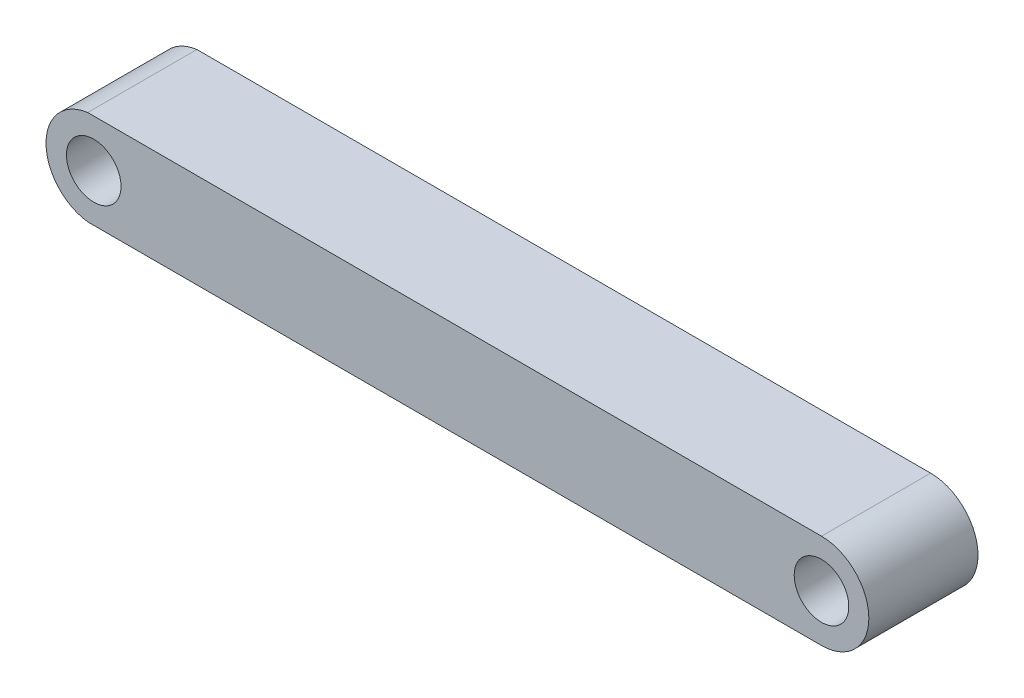
ISO-10303-21;
HEADER;
FILE_DESCRIPTION(('STEP AP214'),'2;1');
FILE_NAME('part.step','',(''),(''),'','','');
FILE_SCHEMA(('AUTOMOTIVE_DESIGN { 1 0 10303 214 1 1 1 1 }'));
ENDSEC;
DATA;
#1=APPLICATION_CONTEXT('core data for automotive mechanical design processes');
#2=APPLICATION_PROTOCOL_DEFINITION('international standard','automotive_design',2000,#1);
#3=PRODUCT_CONTEXT('',#1,'mechanical');
#4=PRODUCT('Part','Part','',(#3));
#5=PRODUCT_RELATED_PRODUCT_CATEGORY('part','',(#4));
#6=PRODUCT_DEFINITION_FORMATION('','',#4);
#7=PRODUCT_DEFINITION_CONTEXT('part definition',#1,'design');
#8=PRODUCT_DEFINITION('design','',#6,#7);
#9=PRODUCT_DEFINITION_SHAPE('','',#8);
#10=(LENGTH_UNIT() NAMED_UNIT(*) SI_UNIT(.MILLI.,.METRE.));
#11=(NAMED_UNIT(*) PLANE_ANGLE_UNIT() SI_UNIT($,.RADIAN.));
#12=(NAMED_UNIT(*) SI_UNIT($,.STERADIAN.) SOLID_ANGLE_UNIT());
#13=UNCERTAINTY_MEASURE_WITH_UNIT(LENGTH_MEASURE(1.E-05),#10,'distance_accuracy_value','');
#14=(GEOMETRIC_REPRESENTATION_CONTEXT(3) GLOBAL_UNCERTAINTY_ASSIGNED_CONTEXT((#13)) GLOBAL_UNIT_ASSIGNED_CONTEXT((#10,
#11,#12)) REPRESENTATION_CONTEXT('',''));
#15=CARTESIAN_POINT('',(0.,0.,0.));
#16=DIRECTION('',(0.,0.,1.));
#17=DIRECTION('',(1.,0.,0.));
#18=AXIS2_PLACEMENT_3D('',#15,#16,#17);
#19=CARTESIAN_POINT('',(-20.2509322553461,0.319741940629474,19.05));
#20=DIRECTION('',(0.,0.,1.));
#21=DIRECTION('',(1.,0.,0.));
#22=AXIS2_PLACEMENT_3D('',#19,#20,#21);
#23=PLANE('',#22);
#24=CARTESIAN_POINT('',(-20.2509322553461,0.319741940629474,19.05));
#25=DIRECTION('',(0.,0.,1.));
#26=DIRECTION('',(1.,0.,0.));
#27=AXIS2_PLACEMENT_3D('',#24,#25,#26);
#28=CIRCLE('',#27,4.7625);
#29=CARTESIAN_POINT('',(-25.0134322553461,0.319741940629474,19.05));
#30=VERTEX_POINT('',#29);
#31=EDGE_CURVE('E119',#30,#30,#28,.T.);
#32=ORIENTED_EDGE('',*,*,#31,.F.);
#33=EDGE_LOOP('',(#32));
#34=FACE_BOUND('',#33,.T.);
#35=CARTESIAN_POINT('',(-20.2509322553461,0.319741940629474,19.05));
#36=DIRECTION('',(0.,0.,1.));
#37=DIRECTION('',(1.,0.,0.));
#38=AXIS2_PLACEMENT_3D('',#35,#36,#37);
#39=CIRCLE('',#38,8.33038536614576);
#40=CARTESIAN_POINT('',(-21.2997323527019,8.58384132920666,19.05));
#41=VERTEX_POINT('',#40);
#42=CARTESIAN_POINT('',(-21.2997323527019,-7.94435744794771,19.05));
#43=VERTEX_POINT('',#42);
#44=EDGE_CURVE('E97',#41,#43,#39,.T.);
#45=ORIENTED_EDGE('',*,*,#44,.T.);
#46=DIRECTION('',(1.,0.,0.));
#47=VECTOR('',#46,1.);
#48=CARTESIAN_POINT('',(-21.2997323527019,-7.94435744794771,19.05));
#49=LINE('',#48,#47);
#50=CARTESIAN_POINT('',(106.749067744654,-7.94435744794771,19.05));
#51=VERTEX_POINT('',#50);
#52=EDGE_CURVE('E93',#43,#51,#49,.T.);
#53=ORIENTED_EDGE('',*,*,#52,.T.);
#54=CARTESIAN_POINT('',(106.749067744654,0.319741940629474,19.05));
#55=DIRECTION('',(0.,0.,1.));
#56=DIRECTION('',(-1.,0.,0.));
#57=AXIS2_PLACEMENT_3D('',#54,#55,#56);
#58=CIRCLE('',#57,8.26409938857719);
#59=CARTESIAN_POINT('',(106.749067744654,8.58384132920666,19.05));
#60=VERTEX_POINT('',#59);
#61=EDGE_CURVE('E96',#51,#60,#58,.T.);
#62=ORIENTED_EDGE('',*,*,#61,.T.);
#63=DIRECTION('',(-1.,0.,0.));
#64=VECTOR('',#63,1.);
#65=CARTESIAN_POINT('',(-21.2997323527019,8.58384132920666,19.05));
#66=LINE('',#65,#64);
#67=EDGE_CURVE('E64',#60,#41,#66,.T.);
#68=ORIENTED_EDGE('',*,*,#67,.T.);
#69=EDGE_LOOP('',(#45,#53,#62,#68));
#70=FACE_BOUND('',#69,.T.);
#71=CARTESIAN_POINT('',(106.749067744654,0.319741940629474,19.05));
#72=DIRECTION('',(0.,0.,1.));
#73=DIRECTION('',(1.,0.,0.));
#74=AXIS2_PLACEMENT_3D('',#71,#72,#73);
#75=CIRCLE('',#74,4.7625);
#76=CARTESIAN_POINT('',(101.986567744654,0.319741940629474,19.05));
#77=VERTEX_POINT('',#76);
#78=EDGE_CURVE('E139',#77,#77,#75,.T.);
#79=ORIENTED_EDGE('',*,*,#78,.F.);
#80=EDGE_LOOP('',(#79));
#81=FACE_BOUND('',#80,.T.);
#82=ADVANCED_FACE('F44',(#34,#70,#81),#23,.T.);
#83=CARTESIAN_POINT('',(-20.2509322553461,0.319741940629474,0.));
#84=DIRECTION('',(0.,0.,1.));
#85=DIRECTION('',(1.,0.,0.));
#86=AXIS2_PLACEMENT_3D('',#83,#84,#85);
#87=PLANE('',#86);
#88=CARTESIAN_POINT('',(-20.2509322553461,0.319741940629474,0.));
#89=DIRECTION('',(0.,0.,1.));
#90=DIRECTION('',(1.,0.,0.));
#91=AXIS2_PLACEMENT_3D('',#88,#89,#90);
#92=CIRCLE('',#91,8.33038536614576);
#93=CARTESIAN_POINT('',(-21.2997323527019,8.58384132920666,0.));
#94=VERTEX_POINT('',#93);
#95=CARTESIAN_POINT('',(-21.2997323527019,-7.94435744794771,0.));
#96=VERTEX_POINT('',#95);
#97=EDGE_CURVE('E114',#94,#96,#92,.T.);
#98=ORIENTED_EDGE('',*,*,#97,.F.);
#99=DIRECTION('',(-1.,0.,0.));
#100=VECTOR('',#99,1.);
#101=CARTESIAN_POINT('',(-21.2997323527019,8.58384132920666,0.));
#102=LINE('',#101,#100);
#103=CARTESIAN_POINT('',(106.749067744654,8.58384132920666,0.));
#104=VERTEX_POINT('',#103);
#105=EDGE_CURVE('E86',#104,#94,#102,.T.);
#106=ORIENTED_EDGE('',*,*,#105,.F.);
#107=CARTESIAN_POINT('',(106.749067744654,0.319741940629474,0.));
#108=DIRECTION('',(0.,0.,1.));
#109=DIRECTION('',(-1.,0.,0.));
#110=AXIS2_PLACEMENT_3D('',#107,#108,#109);
#111=CIRCLE('',#110,8.26409938857719);
#112=CARTESIAN_POINT('',(106.749067744654,-7.94435744794771,0.));
#113=VERTEX_POINT('',#112);
#114=EDGE_CURVE('E79',#113,#104,#111,.T.);
#115=ORIENTED_EDGE('',*,*,#114,.F.);
#116=DIRECTION('',(1.,0.,0.));
#117=VECTOR('',#116,1.);
#118=CARTESIAN_POINT('',(-21.2997323527019,-7.94435744794771,0.));
#119=LINE('',#118,#117);
#120=EDGE_CURVE('E104',#96,#113,#119,.T.);
#121=ORIENTED_EDGE('',*,*,#120,.F.);
#122=EDGE_LOOP('',(#98,#106,#115,#121));
#123=FACE_BOUND('',#122,.T.);
#124=CARTESIAN_POINT('',(-20.2509322553461,0.319741940629474,0.));
#125=DIRECTION('',(0.,0.,1.));
#126=DIRECTION('',(1.,0.,0.));
#127=AXIS2_PLACEMENT_3D('',#124,#125,#126);
#128=CIRCLE('',#127,4.7625);
#129=CARTESIAN_POINT('',(-25.0134322553461,0.319741940629474,0.));
#130=VERTEX_POINT('',#129);
#131=EDGE_CURVE('E136',#130,#130,#128,.T.);
#132=ORIENTED_EDGE('',*,*,#131,.T.);
#133=EDGE_LOOP('',(#132));
#134=FACE_BOUND('',#133,.T.);
#135=CARTESIAN_POINT('',(106.749067744654,0.319741940629474,0.));
#136=DIRECTION('',(0.,0.,1.));
#137=DIRECTION('',(1.,0.,0.));
#138=AXIS2_PLACEMENT_3D('',#135,#136,#137);
#139=CIRCLE('',#138,4.7625);
#140=CARTESIAN_POINT('',(101.986567744654,0.319741940629474,0.));
#141=VERTEX_POINT('',#140);
#142=EDGE_CURVE('E143',#141,#141,#139,.T.);
#143=ORIENTED_EDGE('',*,*,#142,.T.);
#144=EDGE_LOOP('',(#143));
#145=FACE_BOUND('',#144,.T.);
#146=ADVANCED_FACE('F131',(#123,#134,#145),#87,.F.);
#147=CARTESIAN_POINT('',(-20.2509322553461,0.319741940629474,19.05));
#148=DIRECTION('',(0.,0.,-1.));
#149=DIRECTION('',(-1.,0.,0.));
#150=AXIS2_PLACEMENT_3D('',#147,#148,#149);
#151=CYLINDRICAL_SURFACE('',#150,8.33038536614576);
#152=ORIENTED_EDGE('',*,*,#97,.T.);
#153=DIRECTION('',(0.,0.,-1.));
#154=VECTOR('',#153,1.);
#155=CARTESIAN_POINT('',(-21.2997323527019,-7.94435744794771,19.05));
#156=LINE('',#155,#154);
#157=EDGE_CURVE('E11',#43,#96,#156,.T.);
#158=ORIENTED_EDGE('',*,*,#157,.F.);
#159=ORIENTED_EDGE('',*,*,#44,.F.);
#160=DIRECTION('',(0.,0.,-1.));
#161=VECTOR('',#160,1.);
#162=CARTESIAN_POINT('',(-21.2997323527019,8.58384132920666,19.05));
#163=LINE('',#162,#161);
#164=EDGE_CURVE('E110',#41,#94,#163,.T.);
#165=ORIENTED_EDGE('',*,*,#164,.T.);
#166=EDGE_LOOP('',(#152,#158,#159,#165));
#167=FACE_BOUND('',#166,.T.);
#168=ADVANCED_FACE('F50',(#167),#151,.T.);
#169=CARTESIAN_POINT('',(-21.2997323527019,-7.94435744794771,19.05));
#170=DIRECTION('',(0.,1.,0.));
#171=DIRECTION('',(0.,0.,1.));
#172=AXIS2_PLACEMENT_3D('',#169,#170,#171);
#173=PLANE('',#172);
#174=ORIENTED_EDGE('',*,*,#120,.T.);
#175=DIRECTION('',(0.,0.,-1.));
#176=VECTOR('',#175,1.);
#177=CARTESIAN_POINT('',(106.749067744654,-7.94435744794771,19.05));
#178=LINE('',#177,#176);
#179=EDGE_CURVE('E54',#51,#113,#178,.T.);
#180=ORIENTED_EDGE('',*,*,#179,.F.);
#181=ORIENTED_EDGE('',*,*,#52,.F.);
#182=ORIENTED_EDGE('',*,*,#157,.T.);
#183=EDGE_LOOP('',(#174,#180,#181,#182));
#184=FACE_BOUND('',#183,.T.);
#185=ADVANCED_FACE('F105',(#184),#173,.F.);
#186=CARTESIAN_POINT('',(106.749067744654,0.319741940629474,19.05));
#187=DIRECTION('',(0.,0.,-1.));
#188=DIRECTION('',(-1.,0.,0.));
#189=AXIS2_PLACEMENT_3D('',#186,#187,#188);
#190=CYLINDRICAL_SURFACE('',#189,8.26409938857719);
#191=ORIENTED_EDGE('',*,*,#114,.T.);
#192=DIRECTION('',(0.,0.,-1.));
#193=VECTOR('',#192,1.);
#194=CARTESIAN_POINT('',(106.749067744654,8.58384132920666,19.05));
#195=LINE('',#194,#193);
#196=EDGE_CURVE('E103',#60,#104,#195,.T.);
#197=ORIENTED_EDGE('',*,*,#196,.F.);
#198=ORIENTED_EDGE('',*,*,#61,.F.);
#199=ORIENTED_EDGE('',*,*,#179,.T.);
#200=EDGE_LOOP('',(#191,#197,#198,#199));
#201=FACE_BOUND('',#200,.T.);
#202=ADVANCED_FACE('F106',(#201),#190,.T.);
#203=CARTESIAN_POINT('',(-21.2997323527019,8.58384132920666,19.05));
#204=DIRECTION('',(0.,-1.,0.));
#205=DIRECTION('',(0.,0.,-1.));
#206=AXIS2_PLACEMENT_3D('',#203,#204,#205);
#207=PLANE('',#206);
#208=ORIENTED_EDGE('',*,*,#105,.T.);
#209=ORIENTED_EDGE('',*,*,#164,.F.);
#210=ORIENTED_EDGE('',*,*,#67,.F.);
#211=ORIENTED_EDGE('',*,*,#196,.T.);
#212=EDGE_LOOP('',(#208,#209,#210,#211));
#213=FACE_BOUND('',#212,.T.);
#214=ADVANCED_FACE('F126',(#213),#207,.F.);
#215=CARTESIAN_POINT('',(-20.2509322553461,0.319741940629474,19.05));
#216=DIRECTION('',(0.,0.,-1.));
#217=DIRECTION('',(-1.,0.,0.));
#218=AXIS2_PLACEMENT_3D('',#215,#216,#217);
#219=CYLINDRICAL_SURFACE('',#218,4.7625);
#220=CARTESIAN_POINT('',(-25.0134322553461,0.319741940629474,19.05));
#221=CARTESIAN_POINT('',(-25.0134322553461,0.319741940629474,18.8515625));
#222=CARTESIAN_POINT('',(-25.0134322553461,0.319741940629474,18.653125));
#223=CARTESIAN_POINT('',(-25.0134322553461,0.319741940629474,18.25625));
#224=CARTESIAN_POINT('',(-25.0134322553461,0.319741940629474,18.0578125));
#225=CARTESIAN_POINT('',(-25.0134322553461,0.319741940629474,17.6609375));
#226=CARTESIAN_POINT('',(-25.0134322553461,0.319741940629474,17.4625));
#227=CARTESIAN_POINT('',(-25.0134322553461,0.319741940629474,17.065625));
#228=CARTESIAN_POINT('',(-25.0134322553461,0.319741940629474,16.8671875));
#229=CARTESIAN_POINT('',(-25.0134322553461,0.319741940629474,16.4703125));
#230=CARTESIAN_POINT('',(-25.0134322553461,0.319741940629474,16.271875));
#231=CARTESIAN_POINT('',(-25.0134322553461,0.319741940629474,15.875));
#232=CARTESIAN_POINT('',(-25.0134322553461,0.319741940629474,15.6765625));
#233=CARTESIAN_POINT('',(-25.0134322553461,0.319741940629474,15.2796875));
#234=CARTESIAN_POINT('',(-25.0134322553461,0.319741940629474,15.08125));
#235=CARTESIAN_POINT('',(-25.0134322553461,0.319741940629474,14.684375));
#236=CARTESIAN_POINT('',(-25.0134322553461,0.319741940629474,14.4859375));
#237=CARTESIAN_POINT('',(-25.0134322553461,0.319741940629474,14.0890625));
#238=CARTESIAN_POINT('',(-25.0134322553461,0.319741940629474,13.890625));
#239=CARTESIAN_POINT('',(-25.0134322553461,0.319741940629474,13.49375));
#240=CARTESIAN_POINT('',(-25.0134322553461,0.319741940629474,13.2953125));
#241=CARTESIAN_POINT('',(-25.0134322553461,0.319741940629474,12.8984375));
#242=CARTESIAN_POINT('',(-25.0134322553461,0.319741940629474,12.7));
#243=CARTESIAN_POINT('',(-25.0134322553461,0.319741940629474,12.303125));
#244=CARTESIAN_POINT('',(-25.0134322553461,0.319741940629474,12.1046875));
#245=CARTESIAN_POINT('',(-25.0134322553461,0.319741940629474,11.7078125));
#246=CARTESIAN_POINT('',(-25.0134322553461,0.319741940629474,11.509375));
#247=CARTESIAN_POINT('',(-25.0134322553461,0.319741940629474,11.1125));
#248=CARTESIAN_POINT('',(-25.0134322553461,0.319741940629474,10.9140625));
#249=CARTESIAN_POINT('',(-25.0134322553461,0.319741940629474,10.5171875));
#250=CARTESIAN_POINT('',(-25.0134322553461,0.319741940629474,10.31875));
#251=CARTESIAN_POINT('',(-25.0134322553461,0.319741940629474,9.921875));
#252=CARTESIAN_POINT('',(-25.0134322553461,0.319741940629474,9.7234375));
#253=CARTESIAN_POINT('',(-25.0134322553461,0.319741940629474,9.3265625));
#254=CARTESIAN_POINT('',(-25.0134322553461,0.319741940629474,9.128125));
#255=CARTESIAN_POINT('',(-25.0134322553461,0.319741940629474,8.73125));
#256=CARTESIAN_POINT('',(-25.0134322553461,0.319741940629474,8.5328125));
#257=CARTESIAN_POINT('',(-25.0134322553461,0.319741940629474,8.1359375));
#258=CARTESIAN_POINT('',(-25.0134322553461,0.319741940629474,7.9375));
#259=CARTESIAN_POINT('',(-25.0134322553461,0.319741940629474,7.540625));
#260=CARTESIAN_POINT('',(-25.0134322553461,0.319741940629474,7.3421875));
#261=CARTESIAN_POINT('',(-25.0134322553461,0.319741940629474,6.9453125));
#262=CARTESIAN_POINT('',(-25.0134322553461,0.319741940629474,6.746875));
#263=CARTESIAN_POINT('',(-25.0134322553461,0.319741940629474,6.35));
#264=CARTESIAN_POINT('',(-25.0134322553461,0.319741940629474,6.1515625));
#265=CARTESIAN_POINT('',(-25.0134322553461,0.319741940629474,5.7546875));
#266=CARTESIAN_POINT('',(-25.0134322553461,0.319741940629474,5.55625));
#267=CARTESIAN_POINT('',(-25.0134322553461,0.319741940629474,5.159375));
#268=CARTESIAN_POINT('',(-25.0134322553461,0.319741940629474,4.9609375));
#269=CARTESIAN_POINT('',(-25.0134322553461,0.319741940629474,4.5640625));
#270=CARTESIAN_POINT('',(-25.0134322553461,0.319741940629474,4.365625));
#271=CARTESIAN_POINT('',(-25.0134322553461,0.319741940629474,3.96875));
#272=CARTESIAN_POINT('',(-25.0134322553461,0.319741940629474,3.7703125));
#273=CARTESIAN_POINT('',(-25.0134322553461,0.319741940629474,3.3734375));
#274=CARTESIAN_POINT('',(-25.0134322553461,0.319741940629474,3.175));
#275=CARTESIAN_POINT('',(-25.0134322553461,0.319741940629474,2.778125));
#276=CARTESIAN_POINT('',(-25.0134322553461,0.319741940629474,2.5796875));
#277=CARTESIAN_POINT('',(-25.0134322553461,0.319741940629474,2.1828125));
#278=CARTESIAN_POINT('',(-25.0134322553461,0.319741940629474,1.984375));
#279=CARTESIAN_POINT('',(-25.0134322553461,0.319741940629474,1.5875));
#280=CARTESIAN_POINT('',(-25.0134322553461,0.319741940629474,1.3890625));
#281=CARTESIAN_POINT('',(-25.0134322553461,0.319741940629474,0.992187500000001));
#282=CARTESIAN_POINT('',(-25.0134322553461,0.319741940629474,0.793750000000001));
#283=CARTESIAN_POINT('',(-25.0134322553461,0.319741940629474,0.396875));
#284=CARTESIAN_POINT('',(-25.0134322553461,0.319741940629474,0.1984375));
#285=CARTESIAN_POINT('',(-25.0134322553461,0.319741940629474,0.));
#286=B_SPLINE_CURVE_WITH_KNOTS('',3,(#220,#221,#222,#223,#224,#225,#226,#227,#228,#229,#230,
#231,#232,#233,#234,#235,#236,#237,#238,#239,#240,#241,#242,#243,#244,#245,#246,#247,#248,#249,
#250,#251,#252,#253,#254,#255,#256,#257,#258,#259,#260,#261,#262,#263,#264,#265,#266,#267,#268,
#269,#270,#271,#272,#273,#274,#275,#276,#277,#278,#279,#280,#281,#282,#283,#284,#285),
.UNSPECIFIED.,.F.,.F.,(4,2,2,2,2,2,2,2,2,2,2,2,2,2,2,2,2,2,2,2,2,2,2,2,2,2,2,2,2,2,2,2,4),(0.,
0.5953125,1.190625,1.7859375,2.38125,2.9765625,3.571875,4.1671875,4.7625,5.3578125,5.953125,
6.5484375,7.14375,7.7390625,8.334375,8.9296875,9.525,10.1203125,10.715625,11.3109375,11.90625,
12.5015625,13.096875,13.6921875,14.2875,14.8828125,15.478125,16.0734375,16.66875,17.2640625,
17.859375,18.4546875,19.05),.UNSPECIFIED.);
#287=EDGE_CURVE('BSEAM164',#30,#130,#286,.T.);
#288=ORIENTED_EDGE('',*,*,#31,.T.);
#289=ORIENTED_EDGE('',*,*,#131,.F.);
#290=ORIENTED_EDGE('',*,*,#287,.T.);
#291=ORIENTED_EDGE('',*,*,#287,.F.);
#292=EDGE_LOOP('',(#288,#290,#289,#291));
#293=FACE_BOUND('',#292,.T.);
#294=ADVANCED_FACE('F164',(#293),#219,.F.);
#295=CARTESIAN_POINT('',(106.749067744654,0.319741940629474,19.05));
#296=DIRECTION('',(0.,0.,-1.));
#297=DIRECTION('',(-1.,0.,0.));
#298=AXIS2_PLACEMENT_3D('',#295,#296,#297);
#299=CYLINDRICAL_SURFACE('',#298,4.7625);
#300=CARTESIAN_POINT('',(101.986567744654,0.319741940629474,19.05));
#301=CARTESIAN_POINT('',(101.986567744654,0.319741940629474,18.8515625));
#302=CARTESIAN_POINT('',(101.986567744654,0.319741940629474,18.653125));
#303=CARTESIAN_POINT('',(101.986567744654,0.319741940629474,18.25625));
#304=CARTESIAN_POINT('',(101.986567744654,0.319741940629474,18.0578125));
#305=CARTESIAN_POINT('',(101.986567744654,0.319741940629474,17.6609375));
#306=CARTESIAN_POINT('',(101.986567744654,0.319741940629474,17.4625));
#307=CARTESIAN_POINT('',(101.986567744654,0.319741940629474,17.065625));
#308=CARTESIAN_POINT('',(101.986567744654,0.319741940629474,16.8671875));
#309=CARTESIAN_POINT('',(101.986567744654,0.319741940629474,16.4703125));
#310=CARTESIAN_POINT('',(101.986567744654,0.319741940629474,16.271875));
#311=CARTESIAN_POINT('',(101.986567744654,0.319741940629474,15.875));
#312=CARTESIAN_POINT('',(101.986567744654,0.319741940629474,15.6765625));
#313=CARTESIAN_POINT('',(101.986567744654,0.319741940629474,15.2796875));
#314=CARTESIAN_POINT('',(101.986567744654,0.319741940629474,15.08125));
#315=CARTESIAN_POINT('',(101.986567744654,0.319741940629474,14.684375));
#316=CARTESIAN_POINT('',(101.986567744654,0.319741940629474,14.4859375));
#317=CARTESIAN_POINT('',(101.986567744654,0.319741940629474,14.0890625));
#318=CARTESIAN_POINT('',(101.986567744654,0.319741940629474,13.890625));
#319=CARTESIAN_POINT('',(101.986567744654,0.319741940629474,13.49375));
#320=CARTESIAN_POINT('',(101.986567744654,0.319741940629474,13.2953125));
#321=CARTESIAN_POINT('',(101.986567744654,0.319741940629474,12.8984375));
#322=CARTESIAN_POINT('',(101.986567744654,0.319741940629474,12.7));
#323=CARTESIAN_POINT('',(101.986567744654,0.319741940629474,12.303125));
#324=CARTESIAN_POINT('',(101.986567744654,0.319741940629474,12.1046875));
#325=CARTESIAN_POINT('',(101.986567744654,0.319741940629474,11.7078125));
#326=CARTESIAN_POINT('',(101.986567744654,0.319741940629474,11.509375));
#327=CARTESIAN_POINT('',(101.986567744654,0.319741940629474,11.1125));
#328=CARTESIAN_POINT('',(101.986567744654,0.319741940629474,10.9140625));
#329=CARTESIAN_POINT('',(101.986567744654,0.319741940629474,10.5171875));
#330=CARTESIAN_POINT('',(101.986567744654,0.319741940629474,10.31875));
#331=CARTESIAN_POINT('',(101.986567744654,0.319741940629474,9.921875));
#332=CARTESIAN_POINT('',(101.986567744654,0.319741940629474,9.7234375));
#333=CARTESIAN_POINT('',(101.986567744654,0.319741940629474,9.3265625));
#334=CARTESIAN_POINT('',(101.986567744654,0.319741940629474,9.128125));
#335=CARTESIAN_POINT('',(101.986567744654,0.319741940629474,8.73125));
#336=CARTESIAN_POINT('',(101.986567744654,0.319741940629474,8.5328125));
#337=CARTESIAN_POINT('',(101.986567744654,0.319741940629474,8.1359375));
#338=CARTESIAN_POINT('',(101.986567744654,0.319741940629474,7.9375));
#339=CARTESIAN_POINT('',(101.986567744654,0.319741940629474,7.540625));
#340=CARTESIAN_POINT('',(101.986567744654,0.319741940629474,7.3421875));
#341=CARTESIAN_POINT('',(101.986567744654,0.319741940629474,6.9453125));
#342=CARTESIAN_POINT('',(101.986567744654,0.319741940629474,6.746875));
#343=CARTESIAN_POINT('',(101.986567744654,0.319741940629474,6.35));
#344=CARTESIAN_POINT('',(101.986567744654,0.319741940629474,6.1515625));
#345=CARTESIAN_POINT('',(101.986567744654,0.319741940629474,5.7546875));
#346=CARTESIAN_POINT('',(101.986567744654,0.319741940629474,5.55625));
#347=CARTESIAN_POINT('',(101.986567744654,0.319741940629474,5.159375));
#348=CARTESIAN_POINT('',(101.986567744654,0.319741940629474,4.9609375));
#349=CARTESIAN_POINT('',(101.986567744654,0.319741940629474,4.5640625));
#350=CARTESIAN_POINT('',(101.986567744654,0.319741940629474,4.365625));
#351=CARTESIAN_POINT('',(101.986567744654,0.319741940629474,3.96875));
#352=CARTESIAN_POINT('',(101.986567744654,0.319741940629474,3.7703125));
#353=CARTESIAN_POINT('',(101.986567744654,0.319741940629474,3.3734375));
#354=CARTESIAN_POINT('',(101.986567744654,0.319741940629474,3.175));
#355=CARTESIAN_POINT('',(101.986567744654,0.319741940629474,2.778125));
#356=CARTESIAN_POINT('',(101.986567744654,0.319741940629474,2.5796875));
#357=CARTESIAN_POINT('',(101.986567744654,0.319741940629474,2.1828125));
#358=CARTESIAN_POINT('',(101.986567744654,0.319741940629474,1.984375));
#359=CARTESIAN_POINT('',(101.986567744654,0.319741940629474,1.5875));
#360=CARTESIAN_POINT('',(101.986567744654,0.319741940629474,1.3890625));
#361=CARTESIAN_POINT('',(101.986567744654,0.319741940629474,0.992187500000001));
#362=CARTESIAN_POINT('',(101.986567744654,0.319741940629474,0.793750000000001));
#363=CARTESIAN_POINT('',(101.986567744654,0.319741940629474,0.396875));
#364=CARTESIAN_POINT('',(101.986567744654,0.319741940629474,0.1984375));
#365=CARTESIAN_POINT('',(101.986567744654,0.319741940629474,0.));
#366=B_SPLINE_CURVE_WITH_KNOTS('',3,(#300,#301,#302,#303,#304,#305,#306,#307,#308,#309,#310,
#311,#312,#313,#314,#315,#316,#317,#318,#319,#320,#321,#322,#323,#324,#325,#326,#327,#328,#329,
#330,#331,#332,#333,#334,#335,#336,#337,#338,#339,#340,#341,#342,#343,#344,#345,#346,#347,#348,
#349,#350,#351,#352,#353,#354,#355,#356,#357,#358,#359,#360,#361,#362,#363,#364,#365),
.UNSPECIFIED.,.F.,.F.,(4,2,2,2,2,2,2,2,2,2,2,2,2,2,2,2,2,2,2,2,2,2,2,2,2,2,2,2,2,2,2,2,4),(0.,
0.5953125,1.190625,1.7859375,2.38125,2.9765625,3.571875,4.1671875,4.7625,5.3578125,5.953125,
6.5484375,7.14375,7.7390625,8.334375,8.9296875,9.525,10.1203125,10.715625,11.3109375,11.90625,
12.5015625,13.096875,13.6921875,14.2875,14.8828125,15.478125,16.0734375,16.66875,17.2640625,
17.859375,18.4546875,19.05),.UNSPECIFIED.);
#367=EDGE_CURVE('BSEAM152',#77,#141,#366,.T.);
#368=ORIENTED_EDGE('',*,*,#78,.T.);
#369=ORIENTED_EDGE('',*,*,#142,.F.);
#370=ORIENTED_EDGE('',*,*,#367,.T.);
#371=ORIENTED_EDGE('',*,*,#367,.F.);
#372=EDGE_LOOP('',(#368,#370,#369,#371));
#373=FACE_BOUND('',#372,.T.);
#374=ADVANCED_FACE('F152',(#373),#299,.F.);
#375=CLOSED_SHELL('',(#82,#146,#168,#185,#202,#214,#294,#374));
#376=MANIFOLD_SOLID_BREP('B2',#375);
#377=ADVANCED_BREP_SHAPE_REPRESENTATION('',(#18,#376),#14);
#378=SHAPE_DEFINITION_REPRESENTATION(#9,#377);
ENDSEC;
END-ISO-10303-21;
